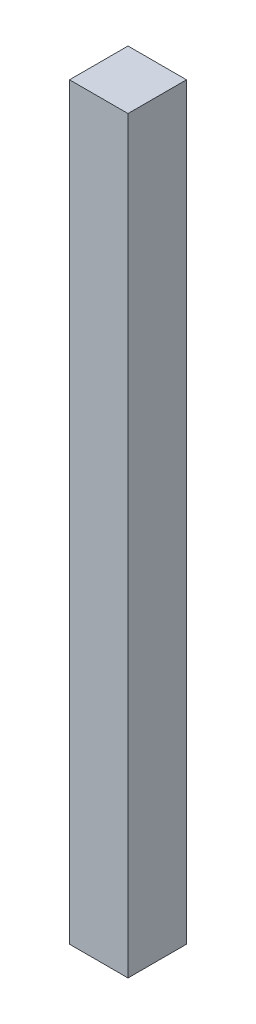
ISO-10303-21;
HEADER;
FILE_DESCRIPTION(('STEP AP214'),'2;1');
FILE_NAME('part.step','',(''),(''),'','','');
FILE_SCHEMA(('AUTOMOTIVE_DESIGN { 1 0 10303 214 1 1 1 1 }'));
ENDSEC;
DATA;
#1=APPLICATION_CONTEXT('core data for automotive mechanical design processes');
#2=APPLICATION_PROTOCOL_DEFINITION('international standard','automotive_design',2000,#1);
#3=PRODUCT_CONTEXT('',#1,'mechanical');
#4=PRODUCT('Part','Part','',(#3));
#5=PRODUCT_RELATED_PRODUCT_CATEGORY('part','',(#4));
#6=PRODUCT_DEFINITION_FORMATION('','',#4);
#7=PRODUCT_DEFINITION_CONTEXT('part definition',#1,'design');
#8=PRODUCT_DEFINITION('design','',#6,#7);
#9=PRODUCT_DEFINITION_SHAPE('','',#8);
#10=(LENGTH_UNIT() NAMED_UNIT(*) SI_UNIT(.MILLI.,.METRE.));
#11=(NAMED_UNIT(*) PLANE_ANGLE_UNIT() SI_UNIT($,.RADIAN.));
#12=(NAMED_UNIT(*) SI_UNIT($,.STERADIAN.) SOLID_ANGLE_UNIT());
#13=UNCERTAINTY_MEASURE_WITH_UNIT(LENGTH_MEASURE(1.E-05),#10,'distance_accuracy_value','');
#14=(GEOMETRIC_REPRESENTATION_CONTEXT(3) GLOBAL_UNCERTAINTY_ASSIGNED_CONTEXT((#13)) GLOBAL_UNIT_ASSIGNED_CONTEXT((#10,
#11,#12)) REPRESENTATION_CONTEXT('',''));
#15=CARTESIAN_POINT('',(0.,0.,0.));
#16=DIRECTION('',(0.,0.,1.));
#17=DIRECTION('',(1.,0.,0.));
#18=AXIS2_PLACEMENT_3D('',#15,#16,#17);
#19=CARTESIAN_POINT('',(17.53,3.7,1.02));
#20=DIRECTION('',(0.,0.,-1.));
#21=DIRECTION('',(-1.,0.,0.));
#22=AXIS2_PLACEMENT_3D('',#19,#20,#21);
#23=PLANE('',#22);
#24=DIRECTION('',(0.,1.,0.));
#25=VECTOR('',#24,1.);
#26=CARTESIAN_POINT('',(17.53,3.7,1.02));
#27=LINE('',#26,#25);
#28=CARTESIAN_POINT('',(17.53,3.7,1.02));
#29=VERTEX_POINT('',#28);
#30=CARTESIAN_POINT('',(17.53,-2.7,1.02));
#31=VERTEX_POINT('',#30);
#32=EDGE_CURVE('E61',#29,#31,#27,.F.);
#33=ORIENTED_EDGE('',*,*,#32,.F.);
#34=DIRECTION('',(-1.,0.,0.));
#35=VECTOR('',#34,1.);
#36=CARTESIAN_POINT('',(17.53,3.7,1.02));
#37=LINE('',#36,#35);
#38=CARTESIAN_POINT('',(18.03,3.7,1.02));
#39=VERTEX_POINT('',#38);
#40=EDGE_CURVE('E20',#29,#39,#37,.F.);
#41=ORIENTED_EDGE('',*,*,#40,.T.);
#42=DIRECTION('',(0.,1.,0.));
#43=VECTOR('',#42,1.);
#44=CARTESIAN_POINT('',(18.03,3.7,1.02));
#45=LINE('',#44,#43);
#46=CARTESIAN_POINT('',(18.03,-2.7,1.02));
#47=VERTEX_POINT('',#46);
#48=EDGE_CURVE('E63',#47,#39,#45,.T.);
#49=ORIENTED_EDGE('',*,*,#48,.F.);
#50=DIRECTION('',(1.,0.,0.));
#51=VECTOR('',#50,1.);
#52=CARTESIAN_POINT('',(0.,-2.7,1.02));
#53=LINE('',#52,#51);
#54=EDGE_CURVE('E56',#47,#31,#53,.F.);
#55=ORIENTED_EDGE('',*,*,#54,.T.);
#56=EDGE_LOOP('',(#33,#41,#49,#55));
#57=FACE_BOUND('',#56,.T.);
#58=ADVANCED_FACE('F17',(#57),#23,.T.);
#59=CARTESIAN_POINT('',(17.53,3.7,1.52));
#60=DIRECTION('',(-1.,0.,0.));
#61=DIRECTION('',(0.,0.,1.));
#62=AXIS2_PLACEMENT_3D('',#59,#60,#61);
#63=PLANE('',#62);
#64=DIRECTION('',(0.,1.,0.));
#65=VECTOR('',#64,1.);
#66=CARTESIAN_POINT('',(17.53,3.7,1.52));
#67=LINE('',#66,#65);
#68=CARTESIAN_POINT('',(17.53,3.7,1.52));
#69=VERTEX_POINT('',#68);
#70=CARTESIAN_POINT('',(17.53,-2.7,1.52));
#71=VERTEX_POINT('',#70);
#72=EDGE_CURVE('E83',#69,#71,#67,.F.);
#73=ORIENTED_EDGE('',*,*,#72,.F.);
#74=DIRECTION('',(0.,0.,1.));
#75=VECTOR('',#74,1.);
#76=CARTESIAN_POINT('',(17.53,3.7,0.));
#77=LINE('',#76,#75);
#78=EDGE_CURVE('E71',#29,#69,#77,.T.);
#79=ORIENTED_EDGE('',*,*,#78,.F.);
#80=ORIENTED_EDGE('',*,*,#32,.T.);
#81=DIRECTION('',(0.,0.,1.));
#82=VECTOR('',#81,1.);
#83=CARTESIAN_POINT('',(17.53,-2.7,0.));
#84=LINE('',#83,#82);
#85=EDGE_CURVE('E65',#31,#71,#84,.T.);
#86=ORIENTED_EDGE('',*,*,#85,.T.);
#87=EDGE_LOOP('',(#73,#79,#80,#86));
#88=FACE_BOUND('',#87,.T.);
#89=ADVANCED_FACE('F68',(#88),#63,.T.);
#90=CARTESIAN_POINT('',(0.,-2.7,0.));
#91=DIRECTION('',(0.,1.,0.));
#92=DIRECTION('',(0.,0.,1.));
#93=AXIS2_PLACEMENT_3D('',#90,#91,#92);
#94=PLANE('',#93);
#95=ORIENTED_EDGE('',*,*,#85,.F.);
#96=ORIENTED_EDGE('',*,*,#54,.F.);
#97=DIRECTION('',(0.,0.,-1.));
#98=VECTOR('',#97,1.);
#99=CARTESIAN_POINT('',(18.03,-2.7,1.52));
#100=LINE('',#99,#98);
#101=CARTESIAN_POINT('',(18.03,-2.7,1.52));
#102=VERTEX_POINT('',#101);
#103=EDGE_CURVE('E76',#102,#47,#100,.T.);
#104=ORIENTED_EDGE('',*,*,#103,.F.);
#105=DIRECTION('',(1.,0.,0.));
#106=VECTOR('',#105,1.);
#107=CARTESIAN_POINT('',(17.53,-2.7,1.52));
#108=LINE('',#107,#106);
#109=EDGE_CURVE('E74',#71,#102,#108,.T.);
#110=ORIENTED_EDGE('',*,*,#109,.F.);
#111=EDGE_LOOP('',(#95,#96,#104,#110));
#112=FACE_BOUND('',#111,.T.);
#113=ADVANCED_FACE('F72',(#112),#94,.F.);
#114=CARTESIAN_POINT('',(18.03,3.7,1.52));
#115=DIRECTION('',(1.,0.,0.));
#116=DIRECTION('',(0.,0.,-1.));
#117=AXIS2_PLACEMENT_3D('',#114,#115,#116);
#118=PLANE('',#117);
#119=ORIENTED_EDGE('',*,*,#48,.T.);
#120=DIRECTION('',(0.,0.,1.));
#121=VECTOR('',#120,1.);
#122=CARTESIAN_POINT('',(18.03,3.7,0.));
#123=LINE('',#122,#121);
#124=CARTESIAN_POINT('',(18.03,3.7,1.52));
#125=VERTEX_POINT('',#124);
#126=EDGE_CURVE('E35',#125,#39,#123,.F.);
#127=ORIENTED_EDGE('',*,*,#126,.F.);
#128=DIRECTION('',(0.,1.,0.));
#129=VECTOR('',#128,1.);
#130=CARTESIAN_POINT('',(18.03,3.7,1.52));
#131=LINE('',#130,#129);
#132=EDGE_CURVE('E26',#102,#125,#131,.T.);
#133=ORIENTED_EDGE('',*,*,#132,.F.);
#134=ORIENTED_EDGE('',*,*,#103,.T.);
#135=EDGE_LOOP('',(#119,#127,#133,#134));
#136=FACE_BOUND('',#135,.T.);
#137=ADVANCED_FACE('F89',(#136),#118,.T.);
#138=CARTESIAN_POINT('',(0.,3.7,0.));
#139=DIRECTION('',(0.,1.,0.));
#140=DIRECTION('',(0.,0.,1.));
#141=AXIS2_PLACEMENT_3D('',#138,#139,#140);
#142=PLANE('',#141);
#143=ORIENTED_EDGE('',*,*,#40,.F.);
#144=ORIENTED_EDGE('',*,*,#78,.T.);
#145=DIRECTION('',(1.,0.,0.));
#146=VECTOR('',#145,1.);
#147=CARTESIAN_POINT('',(17.53,3.7,1.52));
#148=LINE('',#147,#146);
#149=EDGE_CURVE('E11',#125,#69,#148,.F.);
#150=ORIENTED_EDGE('',*,*,#149,.F.);
#151=ORIENTED_EDGE('',*,*,#126,.T.);
#152=EDGE_LOOP('',(#143,#144,#150,#151));
#153=FACE_BOUND('',#152,.T.);
#154=ADVANCED_FACE('F91',(#153),#142,.T.);
#155=CARTESIAN_POINT('',(17.53,3.7,1.52));
#156=DIRECTION('',(0.,0.,1.));
#157=DIRECTION('',(1.,0.,0.));
#158=AXIS2_PLACEMENT_3D('',#155,#156,#157);
#159=PLANE('',#158);
#160=ORIENTED_EDGE('',*,*,#132,.T.);
#161=ORIENTED_EDGE('',*,*,#149,.T.);
#162=ORIENTED_EDGE('',*,*,#72,.T.);
#163=ORIENTED_EDGE('',*,*,#109,.T.);
#164=EDGE_LOOP('',(#160,#161,#162,#163));
#165=FACE_BOUND('',#164,.T.);
#166=ADVANCED_FACE('F88',(#165),#159,.T.);
#167=CLOSED_SHELL('',(#58,#89,#113,#137,#154,#166));
#168=MANIFOLD_SOLID_BREP('B1',#167);
#169=ADVANCED_BREP_SHAPE_REPRESENTATION('',(#18,#168),#14);
#170=SHAPE_DEFINITION_REPRESENTATION(#9,#169);
ENDSEC;
END-ISO-10303-21;
